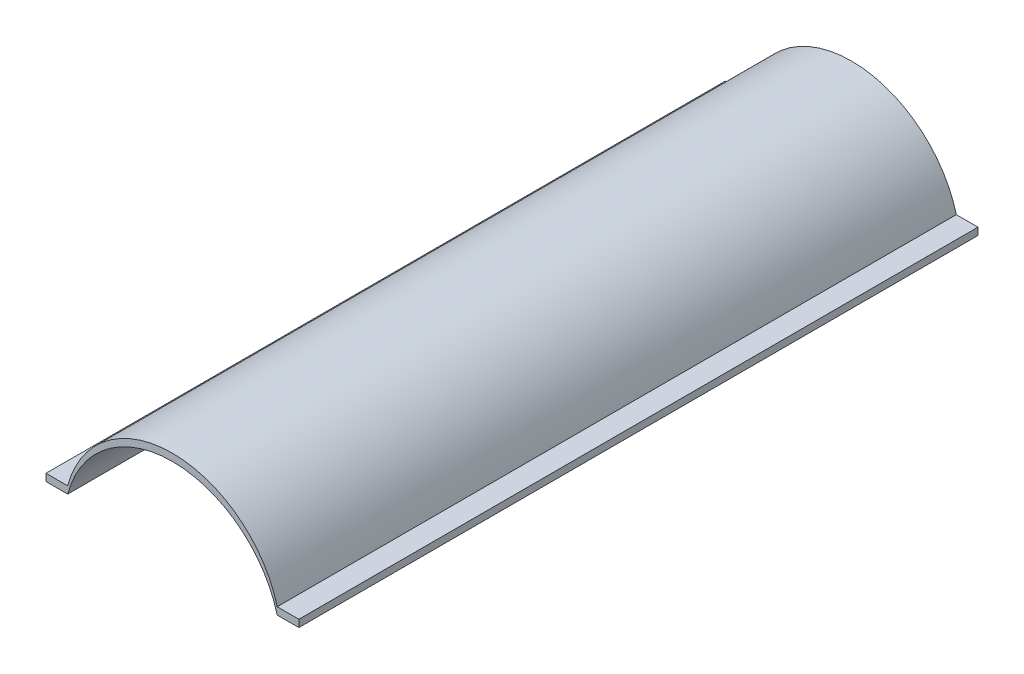
ISO-10303-21;
HEADER;
FILE_DESCRIPTION(('STEP AP214'),'2;1');
FILE_NAME('part.step','',(''),(''),'','','');
FILE_SCHEMA(('AUTOMOTIVE_DESIGN { 1 0 10303 214 1 1 1 1 }'));
ENDSEC;
DATA;
#1=APPLICATION_CONTEXT('core data for automotive mechanical design processes');
#2=APPLICATION_PROTOCOL_DEFINITION('international standard','automotive_design',2000,#1);
#3=PRODUCT_CONTEXT('',#1,'mechanical');
#4=PRODUCT('Part','Part','',(#3));
#5=PRODUCT_RELATED_PRODUCT_CATEGORY('part','',(#4));
#6=PRODUCT_DEFINITION_FORMATION('','',#4);
#7=PRODUCT_DEFINITION_CONTEXT('part definition',#1,'design');
#8=PRODUCT_DEFINITION('design','',#6,#7);
#9=PRODUCT_DEFINITION_SHAPE('','',#8);
#10=(LENGTH_UNIT() NAMED_UNIT(*) SI_UNIT(.MILLI.,.METRE.));
#11=(NAMED_UNIT(*) PLANE_ANGLE_UNIT() SI_UNIT($,.RADIAN.));
#12=(NAMED_UNIT(*) SI_UNIT($,.STERADIAN.) SOLID_ANGLE_UNIT());
#13=UNCERTAINTY_MEASURE_WITH_UNIT(LENGTH_MEASURE(1.E-05),#10,'distance_accuracy_value','');
#14=(GEOMETRIC_REPRESENTATION_CONTEXT(3) GLOBAL_UNCERTAINTY_ASSIGNED_CONTEXT((#13)) GLOBAL_UNIT_ASSIGNED_CONTEXT((#10,
#11,#12)) REPRESENTATION_CONTEXT('',''));
#15=CARTESIAN_POINT('',(0.,0.,0.));
#16=DIRECTION('',(0.,0.,1.));
#17=DIRECTION('',(1.,0.,0.));
#18=AXIS2_PLACEMENT_3D('',#15,#16,#17);
#19=CARTESIAN_POINT('',(-8.45702702702701,0.580140625000001,188.));
#20=DIRECTION('',(0.,1.,0.));
#21=DIRECTION('',(0.,0.,1.));
#22=AXIS2_PLACEMENT_3D('',#19,#20,#21);
#23=PLANE('',#22);
#24=DIRECTION('',(1.,0.,0.));
#25=VECTOR('',#24,1.);
#26=CARTESIAN_POINT('',(-8.45702702702701,0.580140625000001,0.));
#27=LINE('',#26,#25);
#28=CARTESIAN_POINT('',(-8.45702702702701,0.580140625000001,0.));
#29=VERTEX_POINT('',#28);
#30=CARTESIAN_POINT('',(-2.45702702702701,0.580140625000001,0.));
#31=VERTEX_POINT('',#30);
#32=EDGE_CURVE('E129',#29,#31,#27,.T.);
#33=ORIENTED_EDGE('',*,*,#32,.T.);
#34=DIRECTION('',(0.,0.,-1.));
#35=VECTOR('',#34,1.);
#36=CARTESIAN_POINT('',(-2.45702702702701,0.580140625000001,188.));
#37=LINE('',#36,#35);
#38=CARTESIAN_POINT('',(-2.45702702702701,0.580140625000001,188.));
#39=VERTEX_POINT('',#38);
#40=EDGE_CURVE('E11',#39,#31,#37,.T.);
#41=ORIENTED_EDGE('',*,*,#40,.F.);
#42=DIRECTION('',(1.,0.,0.));
#43=VECTOR('',#42,1.);
#44=CARTESIAN_POINT('',(-8.45702702702701,0.580140625000001,188.));
#45=LINE('',#44,#43);
#46=CARTESIAN_POINT('',(-8.45702702702701,0.580140625000001,188.));
#47=VERTEX_POINT('',#46);
#48=EDGE_CURVE('E143',#47,#39,#45,.T.);
#49=ORIENTED_EDGE('',*,*,#48,.F.);
#50=DIRECTION('',(0.,0.,-1.));
#51=VECTOR('',#50,1.);
#52=CARTESIAN_POINT('',(-8.45702702702701,0.580140625000001,188.));
#53=LINE('',#52,#51);
#54=EDGE_CURVE('E125',#47,#29,#53,.T.);
#55=ORIENTED_EDGE('',*,*,#54,.T.);
#56=EDGE_LOOP('',(#33,#41,#49,#55));
#57=FACE_BOUND('',#56,.T.);
#58=ADVANCED_FACE('F33',(#57),#23,.F.);
#59=CARTESIAN_POINT('',(26.542972972973,-7.1010051228686,188.));
#60=DIRECTION('',(0.,0.,-1.));
#61=DIRECTION('',(-1.,0.,0.));
#62=AXIS2_PLACEMENT_3D('',#59,#60,#61);
#63=CYLINDRICAL_SURFACE('',#62,30.);
#64=CARTESIAN_POINT('',(26.542972972973,-7.1010051228686,0.));
#65=DIRECTION('',(0.,0.,-1.));
#66=DIRECTION('',(-1.,0.,0.));
#67=AXIS2_PLACEMENT_3D('',#64,#65,#66);
#68=CIRCLE('',#67,30.);
#69=CARTESIAN_POINT('',(55.542972972973,0.580140625000001,0.));
#70=VERTEX_POINT('',#69);
#71=EDGE_CURVE('E132',#31,#70,#68,.T.);
#72=ORIENTED_EDGE('',*,*,#71,.T.);
#73=DIRECTION('',(0.,0.,-1.));
#74=VECTOR('',#73,1.);
#75=CARTESIAN_POINT('',(55.542972972973,0.580140625000001,188.));
#76=LINE('',#75,#74);
#77=CARTESIAN_POINT('',(55.542972972973,0.580140625000001,188.));
#78=VERTEX_POINT('',#77);
#79=EDGE_CURVE('E41',#78,#70,#76,.T.);
#80=ORIENTED_EDGE('',*,*,#79,.F.);
#81=CARTESIAN_POINT('',(26.542972972973,-7.1010051228686,188.));
#82=DIRECTION('',(0.,0.,-1.));
#83=DIRECTION('',(-1.,0.,0.));
#84=AXIS2_PLACEMENT_3D('',#81,#82,#83);
#85=CIRCLE('',#84,30.);
#86=EDGE_CURVE('E92',#39,#78,#85,.T.);
#87=ORIENTED_EDGE('',*,*,#86,.F.);
#88=ORIENTED_EDGE('',*,*,#40,.T.);
#89=EDGE_LOOP('',(#72,#80,#87,#88));
#90=FACE_BOUND('',#89,.T.);
#91=ADVANCED_FACE('F178',(#90),#63,.F.);
#92=CARTESIAN_POINT('',(55.542972972973,0.580140625000001,188.));
#93=DIRECTION('',(0.,1.,0.));
#94=DIRECTION('',(0.,0.,1.));
#95=AXIS2_PLACEMENT_3D('',#92,#93,#94);
#96=PLANE('',#95);
#97=DIRECTION('',(1.,0.,0.));
#98=VECTOR('',#97,1.);
#99=CARTESIAN_POINT('',(55.542972972973,0.580140625000001,0.));
#100=LINE('',#99,#98);
#101=CARTESIAN_POINT('',(61.542972972973,0.580140625000001,0.));
#102=VERTEX_POINT('',#101);
#103=EDGE_CURVE('E134',#70,#102,#100,.T.);
#104=ORIENTED_EDGE('',*,*,#103,.T.);
#105=DIRECTION('',(0.,0.,-1.));
#106=VECTOR('',#105,1.);
#107=CARTESIAN_POINT('',(61.542972972973,0.580140625000001,188.));
#108=LINE('',#107,#106);
#109=CARTESIAN_POINT('',(61.542972972973,0.580140625000001,188.));
#110=VERTEX_POINT('',#109);
#111=EDGE_CURVE('E150',#110,#102,#108,.T.);
#112=ORIENTED_EDGE('',*,*,#111,.F.);
#113=DIRECTION('',(1.,0.,0.));
#114=VECTOR('',#113,1.);
#115=CARTESIAN_POINT('',(55.542972972973,0.580140625000001,188.));
#116=LINE('',#115,#114);
#117=EDGE_CURVE('E158',#78,#110,#116,.T.);
#118=ORIENTED_EDGE('',*,*,#117,.F.);
#119=ORIENTED_EDGE('',*,*,#79,.T.);
#120=EDGE_LOOP('',(#104,#112,#118,#119));
#121=FACE_BOUND('',#120,.T.);
#122=ADVANCED_FACE('F156',(#121),#96,.F.);
#123=CARTESIAN_POINT('',(61.542972972973,0.580140625000001,188.));
#124=DIRECTION('',(-1.,0.,0.));
#125=DIRECTION('',(0.,0.,1.));
#126=AXIS2_PLACEMENT_3D('',#123,#124,#125);
#127=PLANE('',#126);
#128=DIRECTION('',(0.,1.,0.));
#129=VECTOR('',#128,1.);
#130=CARTESIAN_POINT('',(61.542972972973,0.580140625000001,0.));
#131=LINE('',#130,#129);
#132=CARTESIAN_POINT('',(61.542972972973,2.580140625,0.));
#133=VERTEX_POINT('',#132);
#134=EDGE_CURVE('E136',#102,#133,#131,.T.);
#135=ORIENTED_EDGE('',*,*,#134,.T.);
#136=DIRECTION('',(0.,0.,-1.));
#137=VECTOR('',#136,1.);
#138=CARTESIAN_POINT('',(61.542972972973,2.580140625,188.));
#139=LINE('',#138,#137);
#140=CARTESIAN_POINT('',(61.542972972973,2.580140625,188.));
#141=VERTEX_POINT('',#140);
#142=EDGE_CURVE('E147',#141,#133,#139,.T.);
#143=ORIENTED_EDGE('',*,*,#142,.F.);
#144=DIRECTION('',(0.,1.,0.));
#145=VECTOR('',#144,1.);
#146=CARTESIAN_POINT('',(61.542972972973,0.580140625000001,188.));
#147=LINE('',#146,#145);
#148=EDGE_CURVE('E170',#110,#141,#147,.T.);
#149=ORIENTED_EDGE('',*,*,#148,.F.);
#150=ORIENTED_EDGE('',*,*,#111,.T.);
#151=EDGE_LOOP('',(#135,#143,#149,#150));
#152=FACE_BOUND('',#151,.T.);
#153=ADVANCED_FACE('F166',(#152),#127,.F.);
#154=CARTESIAN_POINT('',(61.542972972973,2.580140625,188.));
#155=DIRECTION('',(0.,-1.,0.));
#156=DIRECTION('',(0.,0.,-1.));
#157=AXIS2_PLACEMENT_3D('',#154,#155,#156);
#158=PLANE('',#157);
#159=DIRECTION('',(-1.,0.,0.));
#160=VECTOR('',#159,1.);
#161=CARTESIAN_POINT('',(61.542972972973,2.580140625,0.));
#162=LINE('',#161,#160);
#163=CARTESIAN_POINT('',(55.542972972973,2.580140625,0.));
#164=VERTEX_POINT('',#163);
#165=EDGE_CURVE('E138',#133,#164,#162,.T.);
#166=ORIENTED_EDGE('',*,*,#165,.T.);
#167=DIRECTION('',(0.,0.,-1.));
#168=VECTOR('',#167,1.);
#169=CARTESIAN_POINT('',(55.542972972973,2.580140625,188.));
#170=LINE('',#169,#168);
#171=CARTESIAN_POINT('',(55.542972972973,2.580140625,188.));
#172=VERTEX_POINT('',#171);
#173=EDGE_CURVE('E120',#172,#164,#170,.T.);
#174=ORIENTED_EDGE('',*,*,#173,.F.);
#175=DIRECTION('',(-1.,0.,0.));
#176=VECTOR('',#175,1.);
#177=CARTESIAN_POINT('',(61.542972972973,2.580140625,188.));
#178=LINE('',#177,#176);
#179=EDGE_CURVE('E111',#141,#172,#178,.T.);
#180=ORIENTED_EDGE('',*,*,#179,.F.);
#181=ORIENTED_EDGE('',*,*,#142,.T.);
#182=EDGE_LOOP('',(#166,#174,#180,#181));
#183=FACE_BOUND('',#182,.T.);
#184=ADVANCED_FACE('F169',(#183),#158,.F.);
#185=CARTESIAN_POINT('',(26.542972972973,-5.1010051228686,188.));
#186=DIRECTION('',(0.,0.,-1.));
#187=DIRECTION('',(-1.,0.,0.));
#188=AXIS2_PLACEMENT_3D('',#185,#186,#187);
#189=CYLINDRICAL_SURFACE('',#188,30.);
#190=CARTESIAN_POINT('',(26.542972972973,-5.1010051228686,0.));
#191=DIRECTION('',(0.,0.,1.));
#192=DIRECTION('',(-1.,0.,0.));
#193=AXIS2_PLACEMENT_3D('',#190,#191,#192);
#194=CIRCLE('',#193,30.);
#195=CARTESIAN_POINT('',(-2.45702702702701,2.580140625,0.));
#196=VERTEX_POINT('',#195);
#197=EDGE_CURVE('E119',#164,#196,#194,.T.);
#198=ORIENTED_EDGE('',*,*,#197,.T.);
#199=DIRECTION('',(0.,0.,-1.));
#200=VECTOR('',#199,1.);
#201=CARTESIAN_POINT('',(-2.45702702702701,2.580140625,188.));
#202=LINE('',#201,#200);
#203=CARTESIAN_POINT('',(-2.45702702702701,2.580140625,188.));
#204=VERTEX_POINT('',#203);
#205=EDGE_CURVE('E116',#204,#196,#202,.T.);
#206=ORIENTED_EDGE('',*,*,#205,.F.);
#207=CARTESIAN_POINT('',(26.542972972973,-5.1010051228686,188.));
#208=DIRECTION('',(0.,0.,1.));
#209=DIRECTION('',(-1.,0.,0.));
#210=AXIS2_PLACEMENT_3D('',#207,#208,#209);
#211=CIRCLE('',#210,30.);
#212=EDGE_CURVE('E105',#172,#204,#211,.T.);
#213=ORIENTED_EDGE('',*,*,#212,.F.);
#214=ORIENTED_EDGE('',*,*,#173,.T.);
#215=EDGE_LOOP('',(#198,#206,#213,#214));
#216=FACE_BOUND('',#215,.T.);
#217=ADVANCED_FACE('F117',(#216),#189,.T.);
#218=CARTESIAN_POINT('',(-8.45702702702701,2.580140625,188.));
#219=DIRECTION('',(0.,-1.,0.));
#220=DIRECTION('',(0.,0.,-1.));
#221=AXIS2_PLACEMENT_3D('',#218,#219,#220);
#222=PLANE('',#221);
#223=DIRECTION('',(-1.,0.,0.));
#224=VECTOR('',#223,1.);
#225=CARTESIAN_POINT('',(-8.45702702702701,2.580140625,0.));
#226=LINE('',#225,#224);
#227=CARTESIAN_POINT('',(-8.45702702702701,2.580140625,0.));
#228=VERTEX_POINT('',#227);
#229=EDGE_CURVE('E78',#196,#228,#226,.T.);
#230=ORIENTED_EDGE('',*,*,#229,.T.);
#231=DIRECTION('',(0.,0.,-1.));
#232=VECTOR('',#231,1.);
#233=CARTESIAN_POINT('',(-8.45702702702701,2.580140625,188.));
#234=LINE('',#233,#232);
#235=CARTESIAN_POINT('',(-8.45702702702701,2.580140625,188.));
#236=VERTEX_POINT('',#235);
#237=EDGE_CURVE('E121',#236,#228,#234,.T.);
#238=ORIENTED_EDGE('',*,*,#237,.F.);
#239=DIRECTION('',(-1.,0.,0.));
#240=VECTOR('',#239,1.);
#241=CARTESIAN_POINT('',(-8.45702702702701,2.580140625,188.));
#242=LINE('',#241,#240);
#243=EDGE_CURVE('E109',#204,#236,#242,.T.);
#244=ORIENTED_EDGE('',*,*,#243,.F.);
#245=ORIENTED_EDGE('',*,*,#205,.T.);
#246=EDGE_LOOP('',(#230,#238,#244,#245));
#247=FACE_BOUND('',#246,.T.);
#248=ADVANCED_FACE('F123',(#247),#222,.F.);
#249=CARTESIAN_POINT('',(-8.45702702702701,0.580140625000001,188.));
#250=DIRECTION('',(1.,0.,0.));
#251=DIRECTION('',(0.,0.,-1.));
#252=AXIS2_PLACEMENT_3D('',#249,#250,#251);
#253=PLANE('',#252);
#254=DIRECTION('',(0.,-1.,0.));
#255=VECTOR('',#254,1.);
#256=CARTESIAN_POINT('',(-8.45702702702701,0.580140625000001,0.));
#257=LINE('',#256,#255);
#258=EDGE_CURVE('E84',#228,#29,#257,.T.);
#259=ORIENTED_EDGE('',*,*,#258,.T.);
#260=ORIENTED_EDGE('',*,*,#54,.F.);
#261=DIRECTION('',(0.,-1.,0.));
#262=VECTOR('',#261,1.);
#263=CARTESIAN_POINT('',(-8.45702702702701,0.580140625000001,188.));
#264=LINE('',#263,#262);
#265=EDGE_CURVE('E49',#236,#47,#264,.T.);
#266=ORIENTED_EDGE('',*,*,#265,.F.);
#267=ORIENTED_EDGE('',*,*,#237,.T.);
#268=EDGE_LOOP('',(#259,#260,#266,#267));
#269=FACE_BOUND('',#268,.T.);
#270=ADVANCED_FACE('F194',(#269),#253,.F.);
#271=CARTESIAN_POINT('',(26.542972972973,-7.1010051228686,188.));
#272=DIRECTION('',(0.,0.,-1.));
#273=DIRECTION('',(-1.,0.,0.));
#274=AXIS2_PLACEMENT_3D('',#271,#272,#273);
#275=PLANE('',#274);
#276=ORIENTED_EDGE('',*,*,#48,.T.);
#277=ORIENTED_EDGE('',*,*,#86,.T.);
#278=ORIENTED_EDGE('',*,*,#117,.T.);
#279=ORIENTED_EDGE('',*,*,#148,.T.);
#280=ORIENTED_EDGE('',*,*,#179,.T.);
#281=ORIENTED_EDGE('',*,*,#212,.T.);
#282=ORIENTED_EDGE('',*,*,#243,.T.);
#283=ORIENTED_EDGE('',*,*,#265,.T.);
#284=EDGE_LOOP('',(#276,#277,#278,#279,#280,#281,#282,#283));
#285=FACE_BOUND('',#284,.T.);
#286=ADVANCED_FACE('F107',(#285),#275,.F.);
#287=CARTESIAN_POINT('',(26.542972972973,-7.1010051228686,0.));
#288=DIRECTION('',(0.,0.,-1.));
#289=DIRECTION('',(-1.,0.,0.));
#290=AXIS2_PLACEMENT_3D('',#287,#288,#289);
#291=PLANE('',#290);
#292=ORIENTED_EDGE('',*,*,#32,.F.);
#293=ORIENTED_EDGE('',*,*,#258,.F.);
#294=ORIENTED_EDGE('',*,*,#229,.F.);
#295=ORIENTED_EDGE('',*,*,#197,.F.);
#296=ORIENTED_EDGE('',*,*,#165,.F.);
#297=ORIENTED_EDGE('',*,*,#134,.F.);
#298=ORIENTED_EDGE('',*,*,#103,.F.);
#299=ORIENTED_EDGE('',*,*,#71,.F.);
#300=EDGE_LOOP('',(#292,#293,#294,#295,#296,#297,#298,#299));
#301=FACE_BOUND('',#300,.T.);
#302=ADVANCED_FACE('F162',(#301),#291,.T.);
#303=CLOSED_SHELL('',(#58,#91,#122,#153,#184,#217,#248,#270,#286,#302));
#304=MANIFOLD_SOLID_BREP('B2',#303);
#305=ADVANCED_BREP_SHAPE_REPRESENTATION('',(#18,#304),#14);
#306=SHAPE_DEFINITION_REPRESENTATION(#9,#305);
ENDSEC;
END-ISO-10303-21;
